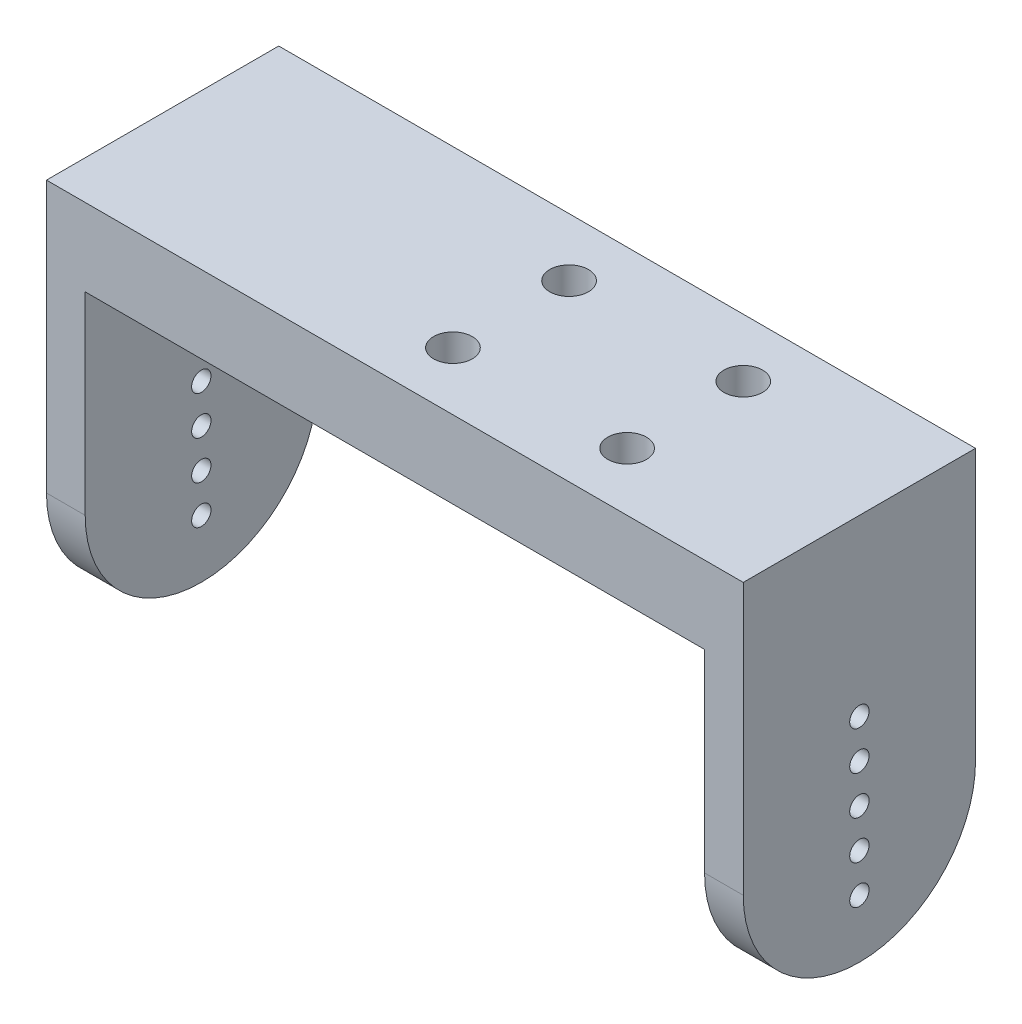
ISO-10303-21;
HEADER;
FILE_DESCRIPTION(('STEP AP214'),'2;1');
FILE_NAME('part.step','',(''),(''),'','','');
FILE_SCHEMA(('AUTOMOTIVE_DESIGN { 1 0 10303 214 1 1 1 1 }'));
ENDSEC;
DATA;
#1=APPLICATION_CONTEXT('core data for automotive mechanical design processes');
#2=APPLICATION_PROTOCOL_DEFINITION('international standard','automotive_design',2000,#1);
#3=PRODUCT_CONTEXT('',#1,'mechanical');
#4=PRODUCT('Part','Part','',(#3));
#5=PRODUCT_RELATED_PRODUCT_CATEGORY('part','',(#4));
#6=PRODUCT_DEFINITION_FORMATION('','',#4);
#7=PRODUCT_DEFINITION_CONTEXT('part definition',#1,'design');
#8=PRODUCT_DEFINITION('design','',#6,#7);
#9=PRODUCT_DEFINITION_SHAPE('','',#8);
#10=(LENGTH_UNIT() NAMED_UNIT(*) SI_UNIT(.MILLI.,.METRE.));
#11=(NAMED_UNIT(*) PLANE_ANGLE_UNIT() SI_UNIT($,.RADIAN.));
#12=(NAMED_UNIT(*) SI_UNIT($,.STERADIAN.) SOLID_ANGLE_UNIT());
#13=UNCERTAINTY_MEASURE_WITH_UNIT(LENGTH_MEASURE(1.E-05),#10,'distance_accuracy_value','');
#14=(GEOMETRIC_REPRESENTATION_CONTEXT(3) GLOBAL_UNCERTAINTY_ASSIGNED_CONTEXT((#13)) GLOBAL_UNIT_ASSIGNED_CONTEXT((#10,
#11,#12)) REPRESENTATION_CONTEXT('',''));
#15=CARTESIAN_POINT('',(0.,0.,0.));
#16=DIRECTION('',(0.,0.,1.));
#17=DIRECTION('',(1.,0.,0.));
#18=AXIS2_PLACEMENT_3D('',#15,#16,#17);
#19=CARTESIAN_POINT('',(0.,8.,0.));
#20=DIRECTION('',(0.,1.,0.));
#21=DIRECTION('',(-1.,0.,0.));
#22=AXIS2_PLACEMENT_3D('',#19,#20,#21);
#23=PLANE('',#22);
#24=CARTESIAN_POINT('',(8.99999999999999,8.,3.));
#25=DIRECTION('',(0.,1.,0.));
#26=DIRECTION('',(-1.,0.,0.));
#27=AXIS2_PLACEMENT_3D('',#24,#25,#26);
#28=CIRCLE('',#27,1.);
#29=CARTESIAN_POINT('',(7.99999999999999,8.,3.));
#30=VERTEX_POINT('',#29);
#31=EDGE_CURVE('E184',#30,#30,#28,.T.);
#32=ORIENTED_EDGE('',*,*,#31,.T.);
#33=EDGE_LOOP('',(#32));
#34=FACE_BOUND('',#33,.T.);
#35=CARTESIAN_POINT('',(8.99999999999999,8.,9.));
#36=DIRECTION('',(0.,1.,0.));
#37=DIRECTION('',(-1.,0.,0.));
#38=AXIS2_PLACEMENT_3D('',#35,#36,#37);
#39=CIRCLE('',#38,1.);
#40=CARTESIAN_POINT('',(7.99999999999999,8.,9.));
#41=VERTEX_POINT('',#40);
#42=EDGE_CURVE('E189',#41,#41,#39,.F.);
#43=ORIENTED_EDGE('',*,*,#42,.F.);
#44=EDGE_LOOP('',(#43));
#45=FACE_BOUND('',#44,.T.);
#46=CARTESIAN_POINT('',(0.,8.,9.));
#47=DIRECTION('',(0.,1.,0.));
#48=DIRECTION('',(-1.,0.,0.));
#49=AXIS2_PLACEMENT_3D('',#46,#47,#48);
#50=CIRCLE('',#49,1.);
#51=CARTESIAN_POINT('',(-1.00000000000001,8.,9.));
#52=VERTEX_POINT('',#51);
#53=EDGE_CURVE('E192',#52,#52,#50,.F.);
#54=ORIENTED_EDGE('',*,*,#53,.F.);
#55=EDGE_LOOP('',(#54));
#56=FACE_BOUND('',#55,.T.);
#57=CARTESIAN_POINT('',(0.,8.,3.));
#58=DIRECTION('',(0.,1.,0.));
#59=DIRECTION('',(-1.,0.,0.));
#60=AXIS2_PLACEMENT_3D('',#57,#58,#59);
#61=CIRCLE('',#60,1.);
#62=CARTESIAN_POINT('',(-1.00000000000001,8.,3.));
#63=VERTEX_POINT('',#62);
#64=EDGE_CURVE('E196',#63,#63,#61,.T.);
#65=ORIENTED_EDGE('',*,*,#64,.T.);
#66=EDGE_LOOP('',(#65));
#67=FACE_BOUND('',#66,.T.);
#68=DIRECTION('',(-1.,0.,0.));
#69=VECTOR('',#68,1.);
#70=CARTESIAN_POINT('',(-16.,8.,1.));
#71=LINE('',#70,#69);
#72=CARTESIAN_POINT('',(16.,8.,1.));
#73=VERTEX_POINT('',#72);
#74=CARTESIAN_POINT('',(-16.,8.,1.));
#75=VERTEX_POINT('',#74);
#76=EDGE_CURVE('E146',#73,#75,#71,.T.);
#77=ORIENTED_EDGE('',*,*,#76,.F.);
#78=DIRECTION('',(0.,0.,1.));
#79=VECTOR('',#78,1.);
#80=CARTESIAN_POINT('',(16.,8.,0.));
#81=LINE('',#80,#79);
#82=CARTESIAN_POINT('',(16.,8.,11.));
#83=VERTEX_POINT('',#82);
#84=EDGE_CURVE('E57',#73,#83,#81,.T.);
#85=ORIENTED_EDGE('',*,*,#84,.T.);
#86=DIRECTION('',(1.,0.,0.));
#87=VECTOR('',#86,1.);
#88=CARTESIAN_POINT('',(-16.,8.,11.));
#89=LINE('',#88,#87);
#90=CARTESIAN_POINT('',(-16.,8.,11.));
#91=VERTEX_POINT('',#90);
#92=EDGE_CURVE('E271',#91,#83,#89,.T.);
#93=ORIENTED_EDGE('',*,*,#92,.F.);
#94=DIRECTION('',(0.,0.,1.));
#95=VECTOR('',#94,1.);
#96=CARTESIAN_POINT('',(-16.,8.,0.));
#97=LINE('',#96,#95);
#98=EDGE_CURVE('E152',#75,#91,#97,.T.);
#99=ORIENTED_EDGE('',*,*,#98,.F.);
#100=EDGE_LOOP('',(#77,#85,#93,#99));
#101=FACE_BOUND('',#100,.T.);
#102=ADVANCED_FACE('F32',(#34,#45,#56,#67,#101),#23,.F.);
#103=CARTESIAN_POINT('',(16.,0.,0.));
#104=DIRECTION('',(1.,0.,0.));
#105=DIRECTION('',(0.,0.,-1.));
#106=AXIS2_PLACEMENT_3D('',#103,#104,#105);
#107=PLANE('',#106);
#108=CARTESIAN_POINT('',(16.,-4.99999999999999,6.));
#109=DIRECTION('',(1.,0.,0.));
#110=DIRECTION('',(0.,0.,-1.));
#111=AXIS2_PLACEMENT_3D('',#108,#109,#110);
#112=CIRCLE('',#111,0.5);
#113=CARTESIAN_POINT('',(16.,-4.99999999999999,5.5));
#114=VERTEX_POINT('',#113);
#115=EDGE_CURVE('E226',#114,#114,#112,.T.);
#116=ORIENTED_EDGE('',*,*,#115,.T.);
#117=EDGE_LOOP('',(#116));
#118=FACE_BOUND('',#117,.T.);
#119=CARTESIAN_POINT('',(16.,-2.99999999999999,6.));
#120=DIRECTION('',(1.,0.,0.));
#121=DIRECTION('',(0.,0.,-1.));
#122=AXIS2_PLACEMENT_3D('',#119,#120,#121);
#123=CIRCLE('',#122,0.5);
#124=CARTESIAN_POINT('',(16.,-2.99999999999999,5.5));
#125=VERTEX_POINT('',#124);
#126=EDGE_CURVE('E214',#125,#125,#123,.T.);
#127=ORIENTED_EDGE('',*,*,#126,.T.);
#128=EDGE_LOOP('',(#127));
#129=FACE_BOUND('',#128,.T.);
#130=CARTESIAN_POINT('',(16.,-0.999999999999992,6.));
#131=DIRECTION('',(1.,0.,0.));
#132=DIRECTION('',(0.,0.,-1.));
#133=AXIS2_PLACEMENT_3D('',#130,#131,#132);
#134=CIRCLE('',#133,0.5);
#135=CARTESIAN_POINT('',(16.,-0.999999999999992,5.5));
#136=VERTEX_POINT('',#135);
#137=EDGE_CURVE('E211',#136,#136,#134,.T.);
#138=ORIENTED_EDGE('',*,*,#137,.T.);
#139=EDGE_LOOP('',(#138));
#140=FACE_BOUND('',#139,.T.);
#141=CARTESIAN_POINT('',(16.,1.00000000000001,6.));
#142=DIRECTION('',(1.,0.,0.));
#143=DIRECTION('',(0.,0.,-1.));
#144=AXIS2_PLACEMENT_3D('',#141,#142,#143);
#145=CIRCLE('',#144,0.5);
#146=CARTESIAN_POINT('',(16.,1.00000000000001,5.5));
#147=VERTEX_POINT('',#146);
#148=EDGE_CURVE('E207',#147,#147,#145,.T.);
#149=ORIENTED_EDGE('',*,*,#148,.T.);
#150=EDGE_LOOP('',(#149));
#151=FACE_BOUND('',#150,.T.);
#152=CARTESIAN_POINT('',(16.,-6.99999999999999,6.));
#153=DIRECTION('',(1.,0.,0.));
#154=DIRECTION('',(0.,0.,-1.));
#155=AXIS2_PLACEMENT_3D('',#152,#153,#154);
#156=CIRCLE('',#155,0.5);
#157=CARTESIAN_POINT('',(16.,-6.99999999999999,5.5));
#158=VERTEX_POINT('',#157);
#159=EDGE_CURVE('E202',#158,#158,#156,.T.);
#160=ORIENTED_EDGE('',*,*,#159,.T.);
#161=EDGE_LOOP('',(#160));
#162=FACE_BOUND('',#161,.T.);
#163=DIRECTION('',(0.,1.,0.));
#164=VECTOR('',#163,1.);
#165=CARTESIAN_POINT('',(16.,6.,1.));
#166=LINE('',#165,#164);
#167=CARTESIAN_POINT('',(16.,6.,1.));
#168=VERTEX_POINT('',#167);
#169=EDGE_CURVE('E263',#168,#73,#166,.T.);
#170=ORIENTED_EDGE('',*,*,#169,.F.);
#171=DIRECTION('',(0.,0.,1.));
#172=VECTOR('',#171,1.);
#173=CARTESIAN_POINT('',(16.,6.,1.));
#174=LINE('',#173,#172);
#175=CARTESIAN_POINT('',(16.,6.,0.));
#176=VERTEX_POINT('',#175);
#177=EDGE_CURVE('E136',#176,#168,#174,.T.);
#178=ORIENTED_EDGE('',*,*,#177,.F.);
#179=DIRECTION('',(0.,1.,0.));
#180=VECTOR('',#179,1.);
#181=CARTESIAN_POINT('',(16.,0.,0.));
#182=LINE('',#181,#180);
#183=CARTESIAN_POINT('',(16.,-3.99999999999999,0.));
#184=VERTEX_POINT('',#183);
#185=EDGE_CURVE('E133',#184,#176,#182,.T.);
#186=ORIENTED_EDGE('',*,*,#185,.F.);
#187=CARTESIAN_POINT('',(16.,-3.99999999999999,6.));
#188=DIRECTION('',(1.,0.,0.));
#189=DIRECTION('',(0.,0.,-1.));
#190=AXIS2_PLACEMENT_3D('',#187,#188,#189);
#191=CIRCLE('',#190,6.);
#192=CARTESIAN_POINT('',(16.,-3.99999999999999,12.));
#193=VERTEX_POINT('',#192);
#194=EDGE_CURVE('E160',#193,#184,#191,.T.);
#195=ORIENTED_EDGE('',*,*,#194,.F.);
#196=DIRECTION('',(0.,1.,0.));
#197=VECTOR('',#196,1.);
#198=CARTESIAN_POINT('',(16.,0.,12.));
#199=LINE('',#198,#197);
#200=CARTESIAN_POINT('',(16.,6.,12.));
#201=VERTEX_POINT('',#200);
#202=EDGE_CURVE('E158',#193,#201,#199,.T.);
#203=ORIENTED_EDGE('',*,*,#202,.T.);
#204=DIRECTION('',(0.,0.,1.));
#205=VECTOR('',#204,1.);
#206=CARTESIAN_POINT('',(16.,6.,12.));
#207=LINE('',#206,#205);
#208=CARTESIAN_POINT('',(16.,6.,11.));
#209=VERTEX_POINT('',#208);
#210=EDGE_CURVE('E49',#209,#201,#207,.T.);
#211=ORIENTED_EDGE('',*,*,#210,.F.);
#212=DIRECTION('',(0.,1.,0.));
#213=VECTOR('',#212,1.);
#214=CARTESIAN_POINT('',(16.,6.,11.));
#215=LINE('',#214,#213);
#216=EDGE_CURVE('E281',#209,#83,#215,.T.);
#217=ORIENTED_EDGE('',*,*,#216,.T.);
#218=ORIENTED_EDGE('',*,*,#84,.F.);
#219=EDGE_LOOP('',(#170,#178,#186,#195,#203,#211,#217,#218));
#220=FACE_BOUND('',#219,.T.);
#221=ADVANCED_FACE('F262',(#118,#129,#140,#151,#162,#220),#107,.F.);
#222=CARTESIAN_POINT('',(-16.,0.,0.));
#223=DIRECTION('',(-1.,0.,0.));
#224=DIRECTION('',(0.,-1.,0.));
#225=AXIS2_PLACEMENT_3D('',#222,#223,#224);
#226=PLANE('',#225);
#227=CARTESIAN_POINT('',(-16.,-4.99999999999999,6.));
#228=DIRECTION('',(-1.,0.,0.));
#229=DIRECTION('',(0.,-1.,0.));
#230=AXIS2_PLACEMENT_3D('',#227,#228,#229);
#231=CIRCLE('',#230,0.5);
#232=CARTESIAN_POINT('',(-16.,-5.49999999999999,6.));
#233=VERTEX_POINT('',#232);
#234=EDGE_CURVE('E36',#233,#233,#231,.T.);
#235=ORIENTED_EDGE('',*,*,#234,.T.);
#236=EDGE_LOOP('',(#235));
#237=FACE_BOUND('',#236,.T.);
#238=CARTESIAN_POINT('',(-16.,-2.99999999999999,6.));
#239=DIRECTION('',(-1.,0.,0.));
#240=DIRECTION('',(0.,-1.,0.));
#241=AXIS2_PLACEMENT_3D('',#238,#239,#240);
#242=CIRCLE('',#241,0.5);
#243=CARTESIAN_POINT('',(-16.,-3.49999999999999,6.));
#244=VERTEX_POINT('',#243);
#245=EDGE_CURVE('E212',#244,#244,#242,.T.);
#246=ORIENTED_EDGE('',*,*,#245,.T.);
#247=EDGE_LOOP('',(#246));
#248=FACE_BOUND('',#247,.T.);
#249=CARTESIAN_POINT('',(-16.,-0.999999999999992,6.));
#250=DIRECTION('',(-1.,0.,0.));
#251=DIRECTION('',(0.,-1.,0.));
#252=AXIS2_PLACEMENT_3D('',#249,#250,#251);
#253=CIRCLE('',#252,0.5);
#254=CARTESIAN_POINT('',(-16.,-1.49999999999999,6.));
#255=VERTEX_POINT('',#254);
#256=EDGE_CURVE('E209',#255,#255,#253,.T.);
#257=ORIENTED_EDGE('',*,*,#256,.T.);
#258=EDGE_LOOP('',(#257));
#259=FACE_BOUND('',#258,.T.);
#260=CARTESIAN_POINT('',(-16.,1.00000000000001,6.));
#261=DIRECTION('',(-1.,0.,0.));
#262=DIRECTION('',(0.,-1.,0.));
#263=AXIS2_PLACEMENT_3D('',#260,#261,#262);
#264=CIRCLE('',#263,0.5);
#265=CARTESIAN_POINT('',(-16.,0.500000000000008,6.));
#266=VERTEX_POINT('',#265);
#267=EDGE_CURVE('E204',#266,#266,#264,.T.);
#268=ORIENTED_EDGE('',*,*,#267,.T.);
#269=EDGE_LOOP('',(#268));
#270=FACE_BOUND('',#269,.T.);
#271=CARTESIAN_POINT('',(-16.,-6.99999999999999,6.));
#272=DIRECTION('',(-1.,0.,0.));
#273=DIRECTION('',(0.,-1.,0.));
#274=AXIS2_PLACEMENT_3D('',#271,#272,#273);
#275=CIRCLE('',#274,0.5);
#276=CARTESIAN_POINT('',(-16.,-7.49999999999999,6.));
#277=VERTEX_POINT('',#276);
#278=EDGE_CURVE('E199',#277,#277,#275,.T.);
#279=ORIENTED_EDGE('',*,*,#278,.T.);
#280=EDGE_LOOP('',(#279));
#281=FACE_BOUND('',#280,.T.);
#282=DIRECTION('',(0.,1.,0.));
#283=VECTOR('',#282,1.);
#284=CARTESIAN_POINT('',(-16.,6.,1.));
#285=LINE('',#284,#283);
#286=CARTESIAN_POINT('',(-16.,6.,1.));
#287=VERTEX_POINT('',#286);
#288=EDGE_CURVE('E265',#287,#75,#285,.T.);
#289=ORIENTED_EDGE('',*,*,#288,.T.);
#290=ORIENTED_EDGE('',*,*,#98,.T.);
#291=DIRECTION('',(0.,1.,0.));
#292=VECTOR('',#291,1.);
#293=CARTESIAN_POINT('',(-16.,6.,11.));
#294=LINE('',#293,#292);
#295=CARTESIAN_POINT('',(-16.,6.,11.));
#296=VERTEX_POINT('',#295);
#297=EDGE_CURVE('E285',#296,#91,#294,.T.);
#298=ORIENTED_EDGE('',*,*,#297,.F.);
#299=DIRECTION('',(0.,0.,-1.));
#300=VECTOR('',#299,1.);
#301=CARTESIAN_POINT('',(-16.,6.,12.));
#302=LINE('',#301,#300);
#303=CARTESIAN_POINT('',(-16.,6.,12.));
#304=VERTEX_POINT('',#303);
#305=EDGE_CURVE('E272',#304,#296,#302,.T.);
#306=ORIENTED_EDGE('',*,*,#305,.F.);
#307=DIRECTION('',(0.,-1.,0.));
#308=VECTOR('',#307,1.);
#309=CARTESIAN_POINT('',(-16.,0.,12.));
#310=LINE('',#309,#308);
#311=CARTESIAN_POINT('',(-16.,-3.99999999999999,12.));
#312=VERTEX_POINT('',#311);
#313=EDGE_CURVE('E154',#304,#312,#310,.T.);
#314=ORIENTED_EDGE('',*,*,#313,.T.);
#315=CARTESIAN_POINT('',(-16.,-3.99999999999999,6.));
#316=DIRECTION('',(-1.,0.,0.));
#317=DIRECTION('',(0.,-1.,0.));
#318=AXIS2_PLACEMENT_3D('',#315,#316,#317);
#319=CIRCLE('',#318,6.);
#320=CARTESIAN_POINT('',(-16.,-3.99999999999999,0.));
#321=VERTEX_POINT('',#320);
#322=EDGE_CURVE('E41',#321,#312,#319,.T.);
#323=ORIENTED_EDGE('',*,*,#322,.F.);
#324=DIRECTION('',(0.,-1.,0.));
#325=VECTOR('',#324,1.);
#326=CARTESIAN_POINT('',(-16.,0.,0.));
#327=LINE('',#326,#325);
#328=CARTESIAN_POINT('',(-16.,6.,0.));
#329=VERTEX_POINT('',#328);
#330=EDGE_CURVE('E129',#329,#321,#327,.T.);
#331=ORIENTED_EDGE('',*,*,#330,.F.);
#332=DIRECTION('',(0.,0.,-1.));
#333=VECTOR('',#332,1.);
#334=CARTESIAN_POINT('',(-16.,6.,1.));
#335=LINE('',#334,#333);
#336=EDGE_CURVE('E137',#287,#329,#335,.T.);
#337=ORIENTED_EDGE('',*,*,#336,.F.);
#338=EDGE_LOOP('',(#289,#290,#298,#306,#314,#323,#331,#337));
#339=FACE_BOUND('',#338,.T.);
#340=ADVANCED_FACE('F148',(#237,#248,#259,#270,#281,#339),#226,.F.);
#341=CARTESIAN_POINT('',(-18.,10.,12.));
#342=DIRECTION('',(0.,-1.,0.));
#343=DIRECTION('',(0.,0.,-1.));
#344=AXIS2_PLACEMENT_3D('',#341,#342,#343);
#345=PLANE('',#344);
#346=DIRECTION('',(-1.,0.,0.));
#347=VECTOR('',#346,1.);
#348=CARTESIAN_POINT('',(-18.,10.,0.));
#349=LINE('',#348,#347);
#350=CARTESIAN_POINT('',(18.,10.,0.));
#351=VERTEX_POINT('',#350);
#352=CARTESIAN_POINT('',(-18.,10.,0.));
#353=VERTEX_POINT('',#352);
#354=EDGE_CURVE('E174',#351,#353,#349,.T.);
#355=ORIENTED_EDGE('',*,*,#354,.T.);
#356=DIRECTION('',(0.,0.,-1.));
#357=VECTOR('',#356,1.);
#358=CARTESIAN_POINT('',(-18.,10.,12.));
#359=LINE('',#358,#357);
#360=CARTESIAN_POINT('',(-18.,10.,12.));
#361=VERTEX_POINT('',#360);
#362=EDGE_CURVE('E172',#361,#353,#359,.T.);
#363=ORIENTED_EDGE('',*,*,#362,.F.);
#364=DIRECTION('',(-1.,0.,0.));
#365=VECTOR('',#364,1.);
#366=CARTESIAN_POINT('',(-18.,10.,12.));
#367=LINE('',#366,#365);
#368=CARTESIAN_POINT('',(18.,10.,12.));
#369=VERTEX_POINT('',#368);
#370=EDGE_CURVE('E166',#369,#361,#367,.T.);
#371=ORIENTED_EDGE('',*,*,#370,.F.);
#372=DIRECTION('',(0.,0.,-1.));
#373=VECTOR('',#372,1.);
#374=CARTESIAN_POINT('',(18.,10.,12.));
#375=LINE('',#374,#373);
#376=EDGE_CURVE('E180',#369,#351,#375,.T.);
#377=ORIENTED_EDGE('',*,*,#376,.T.);
#378=EDGE_LOOP('',(#355,#363,#371,#377));
#379=FACE_BOUND('',#378,.T.);
#380=CARTESIAN_POINT('',(8.99999999999999,10.,3.));
#381=DIRECTION('',(0.,1.,0.));
#382=DIRECTION('',(0.,0.,1.));
#383=AXIS2_PLACEMENT_3D('',#380,#381,#382);
#384=CIRCLE('',#383,1.);
#385=CARTESIAN_POINT('',(8.99999999999999,10.,4.));
#386=VERTEX_POINT('',#385);
#387=EDGE_CURVE('E188',#386,#386,#384,.T.);
#388=ORIENTED_EDGE('',*,*,#387,.F.);
#389=EDGE_LOOP('',(#388));
#390=FACE_BOUND('',#389,.T.);
#391=CARTESIAN_POINT('',(8.99999999999999,10.,9.));
#392=DIRECTION('',(0.,-1.,0.));
#393=DIRECTION('',(0.,0.,-1.));
#394=AXIS2_PLACEMENT_3D('',#391,#392,#393);
#395=CIRCLE('',#394,1.);
#396=CARTESIAN_POINT('',(8.99999999999999,10.,8.));
#397=VERTEX_POINT('',#396);
#398=EDGE_CURVE('E236',#397,#397,#395,.T.);
#399=ORIENTED_EDGE('',*,*,#398,.T.);
#400=EDGE_LOOP('',(#399));
#401=FACE_BOUND('',#400,.T.);
#402=CARTESIAN_POINT('',(0.,10.,9.));
#403=DIRECTION('',(0.,-1.,0.));
#404=DIRECTION('',(0.,0.,-1.));
#405=AXIS2_PLACEMENT_3D('',#402,#403,#404);
#406=CIRCLE('',#405,1.);
#407=CARTESIAN_POINT('',(0.,10.,8.));
#408=VERTEX_POINT('',#407);
#409=EDGE_CURVE('E239',#408,#408,#406,.T.);
#410=ORIENTED_EDGE('',*,*,#409,.T.);
#411=EDGE_LOOP('',(#410));
#412=FACE_BOUND('',#411,.T.);
#413=CARTESIAN_POINT('',(0.,10.,3.));
#414=DIRECTION('',(0.,1.,0.));
#415=DIRECTION('',(0.,0.,1.));
#416=AXIS2_PLACEMENT_3D('',#413,#414,#415);
#417=CIRCLE('',#416,1.);
#418=CARTESIAN_POINT('',(0.,10.,4.));
#419=VERTEX_POINT('',#418);
#420=EDGE_CURVE('E193',#419,#419,#417,.T.);
#421=ORIENTED_EDGE('',*,*,#420,.F.);
#422=EDGE_LOOP('',(#421));
#423=FACE_BOUND('',#422,.T.);
#424=ADVANCED_FACE('F317',(#379,#390,#401,#412,#423),#345,.F.);
#425=CARTESIAN_POINT('',(18.,10.,12.));
#426=DIRECTION('',(-1.,0.,0.));
#427=DIRECTION('',(0.,-1.,0.));
#428=AXIS2_PLACEMENT_3D('',#425,#426,#427);
#429=PLANE('',#428);
#430=CARTESIAN_POINT('',(18.,-4.99999999999999,6.));
#431=DIRECTION('',(1.,0.,0.));
#432=DIRECTION('',(0.,0.,-1.));
#433=AXIS2_PLACEMENT_3D('',#430,#431,#432);
#434=CIRCLE('',#433,0.5);
#435=CARTESIAN_POINT('',(18.,-4.99999999999999,5.5));
#436=VERTEX_POINT('',#435);
#437=EDGE_CURVE('E291',#436,#436,#434,.T.);
#438=ORIENTED_EDGE('',*,*,#437,.F.);
#439=EDGE_LOOP('',(#438));
#440=FACE_BOUND('',#439,.T.);
#441=CARTESIAN_POINT('',(18.,-2.99999999999999,6.));
#442=DIRECTION('',(1.,0.,0.));
#443=DIRECTION('',(0.,0.,-1.));
#444=AXIS2_PLACEMENT_3D('',#441,#442,#443);
#445=CIRCLE('',#444,0.5);
#446=CARTESIAN_POINT('',(18.,-2.99999999999999,5.5));
#447=VERTEX_POINT('',#446);
#448=EDGE_CURVE('E297',#447,#447,#445,.T.);
#449=ORIENTED_EDGE('',*,*,#448,.F.);
#450=EDGE_LOOP('',(#449));
#451=FACE_BOUND('',#450,.T.);
#452=CARTESIAN_POINT('',(18.,-0.999999999999992,6.));
#453=DIRECTION('',(1.,0.,0.));
#454=DIRECTION('',(0.,0.,-1.));
#455=AXIS2_PLACEMENT_3D('',#452,#453,#454);
#456=CIRCLE('',#455,0.5);
#457=CARTESIAN_POINT('',(18.,-0.999999999999992,5.5));
#458=VERTEX_POINT('',#457);
#459=EDGE_CURVE('E303',#458,#458,#456,.T.);
#460=ORIENTED_EDGE('',*,*,#459,.F.);
#461=EDGE_LOOP('',(#460));
#462=FACE_BOUND('',#461,.T.);
#463=CARTESIAN_POINT('',(18.,1.00000000000001,6.));
#464=DIRECTION('',(1.,0.,0.));
#465=DIRECTION('',(0.,0.,-1.));
#466=AXIS2_PLACEMENT_3D('',#463,#464,#465);
#467=CIRCLE('',#466,0.5);
#468=CARTESIAN_POINT('',(18.,1.00000000000001,5.5));
#469=VERTEX_POINT('',#468);
#470=EDGE_CURVE('E288',#469,#469,#467,.T.);
#471=ORIENTED_EDGE('',*,*,#470,.F.);
#472=EDGE_LOOP('',(#471));
#473=FACE_BOUND('',#472,.T.);
#474=CARTESIAN_POINT('',(18.,-6.99999999999999,6.));
#475=DIRECTION('',(1.,0.,0.));
#476=DIRECTION('',(0.,0.,-1.));
#477=AXIS2_PLACEMENT_3D('',#474,#475,#476);
#478=CIRCLE('',#477,0.5);
#479=CARTESIAN_POINT('',(18.,-6.99999999999999,5.5));
#480=VERTEX_POINT('',#479);
#481=EDGE_CURVE('E229',#480,#480,#478,.T.);
#482=ORIENTED_EDGE('',*,*,#481,.F.);
#483=EDGE_LOOP('',(#482));
#484=FACE_BOUND('',#483,.T.);
#485=CARTESIAN_POINT('',(18.,-3.99999999999999,6.));
#486=DIRECTION('',(1.,0.,0.));
#487=DIRECTION('',(0.,0.,-1.));
#488=AXIS2_PLACEMENT_3D('',#485,#486,#487);
#489=CIRCLE('',#488,6.);
#490=CARTESIAN_POINT('',(18.,-3.99999999999999,12.));
#491=VERTEX_POINT('',#490);
#492=CARTESIAN_POINT('',(18.,-3.99999999999999,0.));
#493=VERTEX_POINT('',#492);
#494=EDGE_CURVE('E247',#491,#493,#489,.T.);
#495=ORIENTED_EDGE('',*,*,#494,.T.);
#496=DIRECTION('',(0.,1.,0.));
#497=VECTOR('',#496,1.);
#498=CARTESIAN_POINT('',(18.,10.,0.));
#499=LINE('',#498,#497);
#500=EDGE_CURVE('E162',#493,#351,#499,.T.);
#501=ORIENTED_EDGE('',*,*,#500,.T.);
#502=ORIENTED_EDGE('',*,*,#376,.F.);
#503=DIRECTION('',(0.,1.,0.));
#504=VECTOR('',#503,1.);
#505=CARTESIAN_POINT('',(18.,10.,12.));
#506=LINE('',#505,#504);
#507=EDGE_CURVE('E164',#491,#369,#506,.T.);
#508=ORIENTED_EDGE('',*,*,#507,.F.);
#509=EDGE_LOOP('',(#495,#501,#502,#508));
#510=FACE_BOUND('',#509,.T.);
#511=ADVANCED_FACE('F34',(#440,#451,#462,#473,#484,#510),#429,.F.);
#512=CARTESIAN_POINT('',(-18.,10.,12.));
#513=DIRECTION('',(1.,0.,0.));
#514=DIRECTION('',(0.,1.,0.));
#515=AXIS2_PLACEMENT_3D('',#512,#513,#514);
#516=PLANE('',#515);
#517=CARTESIAN_POINT('',(-18.,-4.99999999999999,6.));
#518=DIRECTION('',(1.,0.,0.));
#519=DIRECTION('',(0.,0.,-1.));
#520=AXIS2_PLACEMENT_3D('',#517,#518,#519);
#521=CIRCLE('',#520,0.5);
#522=CARTESIAN_POINT('',(-18.,-4.99999999999999,5.5));
#523=VERTEX_POINT('',#522);
#524=EDGE_CURVE('E208',#523,#523,#521,.T.);
#525=ORIENTED_EDGE('',*,*,#524,.T.);
#526=EDGE_LOOP('',(#525));
#527=FACE_BOUND('',#526,.T.);
#528=CARTESIAN_POINT('',(-18.,-2.99999999999999,6.));
#529=DIRECTION('',(1.,0.,0.));
#530=DIRECTION('',(0.,0.,-1.));
#531=AXIS2_PLACEMENT_3D('',#528,#529,#530);
#532=CIRCLE('',#531,0.5);
#533=CARTESIAN_POINT('',(-18.,-2.99999999999999,5.5));
#534=VERTEX_POINT('',#533);
#535=EDGE_CURVE('E294',#534,#534,#532,.T.);
#536=ORIENTED_EDGE('',*,*,#535,.T.);
#537=EDGE_LOOP('',(#536));
#538=FACE_BOUND('',#537,.T.);
#539=CARTESIAN_POINT('',(-18.,-0.999999999999992,6.));
#540=DIRECTION('',(1.,0.,0.));
#541=DIRECTION('',(0.,0.,-1.));
#542=AXIS2_PLACEMENT_3D('',#539,#540,#541);
#543=CIRCLE('',#542,0.5);
#544=CARTESIAN_POINT('',(-18.,-0.999999999999992,5.5));
#545=VERTEX_POINT('',#544);
#546=EDGE_CURVE('E300',#545,#545,#543,.T.);
#547=ORIENTED_EDGE('',*,*,#546,.T.);
#548=EDGE_LOOP('',(#547));
#549=FACE_BOUND('',#548,.T.);
#550=CARTESIAN_POINT('',(-18.,1.00000000000001,6.));
#551=DIRECTION('',(1.,0.,0.));
#552=DIRECTION('',(0.,0.,-1.));
#553=AXIS2_PLACEMENT_3D('',#550,#551,#552);
#554=CIRCLE('',#553,0.5);
#555=CARTESIAN_POINT('',(-18.,1.00000000000001,5.5));
#556=VERTEX_POINT('',#555);
#557=EDGE_CURVE('E306',#556,#556,#554,.T.);
#558=ORIENTED_EDGE('',*,*,#557,.T.);
#559=EDGE_LOOP('',(#558));
#560=FACE_BOUND('',#559,.T.);
#561=CARTESIAN_POINT('',(-18.,-6.99999999999999,6.));
#562=DIRECTION('',(1.,0.,0.));
#563=DIRECTION('',(0.,0.,-1.));
#564=AXIS2_PLACEMENT_3D('',#561,#562,#563);
#565=CIRCLE('',#564,0.5);
#566=CARTESIAN_POINT('',(-18.,-6.99999999999999,5.5));
#567=VERTEX_POINT('',#566);
#568=EDGE_CURVE('E203',#567,#567,#565,.T.);
#569=ORIENTED_EDGE('',*,*,#568,.T.);
#570=EDGE_LOOP('',(#569));
#571=FACE_BOUND('',#570,.T.);
#572=DIRECTION('',(0.,-1.,0.));
#573=VECTOR('',#572,1.);
#574=CARTESIAN_POINT('',(-18.,10.,0.));
#575=LINE('',#574,#573);
#576=CARTESIAN_POINT('',(-18.,-3.99999999999999,0.));
#577=VERTEX_POINT('',#576);
#578=EDGE_CURVE('E167',#353,#577,#575,.T.);
#579=ORIENTED_EDGE('',*,*,#578,.T.);
#580=CARTESIAN_POINT('',(-18.,-3.99999999999999,6.));
#581=DIRECTION('',(1.,0.,0.));
#582=DIRECTION('',(0.,0.,-1.));
#583=AXIS2_PLACEMENT_3D('',#580,#581,#582);
#584=CIRCLE('',#583,6.);
#585=CARTESIAN_POINT('',(-18.,-3.99999999999999,12.));
#586=VERTEX_POINT('',#585);
#587=EDGE_CURVE('E248',#586,#577,#584,.T.);
#588=ORIENTED_EDGE('',*,*,#587,.F.);
#589=DIRECTION('',(0.,-1.,0.));
#590=VECTOR('',#589,1.);
#591=CARTESIAN_POINT('',(-18.,10.,12.));
#592=LINE('',#591,#590);
#593=EDGE_CURVE('E169',#361,#586,#592,.T.);
#594=ORIENTED_EDGE('',*,*,#593,.F.);
#595=ORIENTED_EDGE('',*,*,#362,.T.);
#596=EDGE_LOOP('',(#579,#588,#594,#595));
#597=FACE_BOUND('',#596,.T.);
#598=ADVANCED_FACE('F316',(#527,#538,#549,#560,#571,#597),#516,.F.);
#599=CARTESIAN_POINT('',(0.,0.,0.));
#600=DIRECTION('',(0.,0.,1.));
#601=DIRECTION('',(1.,0.,0.));
#602=AXIS2_PLACEMENT_3D('',#599,#600,#601);
#603=PLANE('',#602);
#604=DIRECTION('',(1.,0.,0.));
#605=VECTOR('',#604,1.);
#606=CARTESIAN_POINT('',(-16.,6.,0.));
#607=LINE('',#606,#605);
#608=EDGE_CURVE('E124',#329,#176,#607,.T.);
#609=ORIENTED_EDGE('',*,*,#608,.F.);
#610=ORIENTED_EDGE('',*,*,#330,.T.);
#611=DIRECTION('',(1.,0.,0.));
#612=VECTOR('',#611,1.);
#613=CARTESIAN_POINT('',(-18.,-3.99999999999999,0.));
#614=LINE('',#613,#612);
#615=EDGE_CURVE('E187',#577,#321,#614,.T.);
#616=ORIENTED_EDGE('',*,*,#615,.F.);
#617=ORIENTED_EDGE('',*,*,#578,.F.);
#618=ORIENTED_EDGE('',*,*,#354,.F.);
#619=ORIENTED_EDGE('',*,*,#500,.F.);
#620=DIRECTION('',(1.,0.,0.));
#621=VECTOR('',#620,1.);
#622=CARTESIAN_POINT('',(-18.,-3.99999999999999,0.));
#623=LINE('',#622,#621);
#624=EDGE_CURVE('E11',#184,#493,#623,.T.);
#625=ORIENTED_EDGE('',*,*,#624,.F.);
#626=ORIENTED_EDGE('',*,*,#185,.T.);
#627=EDGE_LOOP('',(#609,#610,#616,#617,#618,#619,#625,#626));
#628=FACE_BOUND('',#627,.T.);
#629=ADVANCED_FACE('F126',(#628),#603,.F.);
#630=CARTESIAN_POINT('',(0.,0.,12.));
#631=DIRECTION('',(0.,0.,1.));
#632=DIRECTION('',(1.,0.,0.));
#633=AXIS2_PLACEMENT_3D('',#630,#631,#632);
#634=PLANE('',#633);
#635=ORIENTED_EDGE('',*,*,#313,.F.);
#636=DIRECTION('',(-1.,0.,0.));
#637=VECTOR('',#636,1.);
#638=CARTESIAN_POINT('',(-16.,6.,12.));
#639=LINE('',#638,#637);
#640=EDGE_CURVE('E278',#201,#304,#639,.T.);
#641=ORIENTED_EDGE('',*,*,#640,.F.);
#642=ORIENTED_EDGE('',*,*,#202,.F.);
#643=DIRECTION('',(1.,0.,0.));
#644=VECTOR('',#643,1.);
#645=CARTESIAN_POINT('',(-18.,-3.99999999999999,12.));
#646=LINE('',#645,#644);
#647=EDGE_CURVE('E250',#193,#491,#646,.T.);
#648=ORIENTED_EDGE('',*,*,#647,.T.);
#649=ORIENTED_EDGE('',*,*,#507,.T.);
#650=ORIENTED_EDGE('',*,*,#370,.T.);
#651=ORIENTED_EDGE('',*,*,#593,.T.);
#652=EDGE_CURVE('E252',#586,#312,#646,.T.);
#653=ORIENTED_EDGE('',*,*,#652,.T.);
#654=EDGE_LOOP('',(#635,#641,#642,#648,#649,#650,#651,#653));
#655=FACE_BOUND('',#654,.T.);
#656=ADVANCED_FACE('F325',(#655),#634,.T.);
#657=CARTESIAN_POINT('',(-18.,-3.99999999999999,6.));
#658=DIRECTION('',(1.,0.,0.));
#659=DIRECTION('',(0.,0.,-1.));
#660=AXIS2_PLACEMENT_3D('',#657,#658,#659);
#661=CYLINDRICAL_SURFACE('',#660,6.);
#662=ORIENTED_EDGE('',*,*,#322,.T.);
#663=ORIENTED_EDGE('',*,*,#652,.F.);
#664=ORIENTED_EDGE('',*,*,#587,.T.);
#665=ORIENTED_EDGE('',*,*,#615,.T.);
#666=EDGE_LOOP('',(#662,#663,#664,#665));
#667=FACE_BOUND('',#666,.T.);
#668=ADVANCED_FACE('F359',(#667),#661,.T.);
#669=ORIENTED_EDGE('',*,*,#194,.T.);
#670=ORIENTED_EDGE('',*,*,#624,.T.);
#671=ORIENTED_EDGE('',*,*,#494,.F.);
#672=ORIENTED_EDGE('',*,*,#647,.F.);
#673=EDGE_LOOP('',(#669,#670,#671,#672));
#674=FACE_BOUND('',#673,.T.);
#675=ADVANCED_FACE('F256',(#674),#661,.T.);
#676=CARTESIAN_POINT('',(8.99999999999999,0.,3.));
#677=DIRECTION('',(0.,1.,0.));
#678=DIRECTION('',(0.,0.,1.));
#679=AXIS2_PLACEMENT_3D('',#676,#677,#678);
#680=CYLINDRICAL_SURFACE('',#679,1.);
#681=ORIENTED_EDGE('',*,*,#387,.T.);
#682=EDGE_LOOP('',(#681));
#683=FACE_BOUND('',#682,.T.);
#684=ORIENTED_EDGE('',*,*,#31,.F.);
#685=EDGE_LOOP('',(#684));
#686=FACE_BOUND('',#685,.T.);
#687=ADVANCED_FACE('F402',(#683,#686),#680,.F.);
#688=CARTESIAN_POINT('',(8.99999999999999,0.,9.));
#689=DIRECTION('',(0.,1.,0.));
#690=DIRECTION('',(0.,0.,1.));
#691=AXIS2_PLACEMENT_3D('',#688,#689,#690);
#692=CYLINDRICAL_SURFACE('',#691,1.);
#693=ORIENTED_EDGE('',*,*,#398,.F.);
#694=EDGE_LOOP('',(#693));
#695=FACE_BOUND('',#694,.T.);
#696=ORIENTED_EDGE('',*,*,#42,.T.);
#697=EDGE_LOOP('',(#696));
#698=FACE_BOUND('',#697,.T.);
#699=ADVANCED_FACE('F395',(#695,#698),#692,.F.);
#700=CARTESIAN_POINT('',(0.,0.,9.));
#701=DIRECTION('',(0.,1.,0.));
#702=DIRECTION('',(0.,0.,1.));
#703=AXIS2_PLACEMENT_3D('',#700,#701,#702);
#704=CYLINDRICAL_SURFACE('',#703,1.);
#705=ORIENTED_EDGE('',*,*,#409,.F.);
#706=EDGE_LOOP('',(#705));
#707=FACE_BOUND('',#706,.T.);
#708=ORIENTED_EDGE('',*,*,#53,.T.);
#709=EDGE_LOOP('',(#708));
#710=FACE_BOUND('',#709,.T.);
#711=ADVANCED_FACE('F384',(#707,#710),#704,.F.);
#712=CARTESIAN_POINT('',(0.,0.,3.));
#713=DIRECTION('',(0.,1.,0.));
#714=DIRECTION('',(0.,0.,1.));
#715=AXIS2_PLACEMENT_3D('',#712,#713,#714);
#716=CYLINDRICAL_SURFACE('',#715,1.);
#717=ORIENTED_EDGE('',*,*,#420,.T.);
#718=EDGE_LOOP('',(#717));
#719=FACE_BOUND('',#718,.T.);
#720=ORIENTED_EDGE('',*,*,#64,.F.);
#721=EDGE_LOOP('',(#720));
#722=FACE_BOUND('',#721,.T.);
#723=ADVANCED_FACE('F380',(#719,#722),#716,.F.);
#724=CARTESIAN_POINT('',(-18.,-6.99999999999999,6.));
#725=DIRECTION('',(1.,0.,0.));
#726=DIRECTION('',(0.,0.,-1.));
#727=AXIS2_PLACEMENT_3D('',#724,#725,#726);
#728=CYLINDRICAL_SURFACE('',#727,0.5);
#729=ORIENTED_EDGE('',*,*,#568,.F.);
#730=EDGE_LOOP('',(#729));
#731=FACE_BOUND('',#730,.T.);
#732=ORIENTED_EDGE('',*,*,#278,.F.);
#733=EDGE_LOOP('',(#732));
#734=FACE_BOUND('',#733,.T.);
#735=ADVANCED_FACE('F383',(#731,#734),#728,.F.);
#736=ORIENTED_EDGE('',*,*,#481,.T.);
#737=EDGE_LOOP('',(#736));
#738=FACE_BOUND('',#737,.T.);
#739=ORIENTED_EDGE('',*,*,#159,.F.);
#740=EDGE_LOOP('',(#739));
#741=FACE_BOUND('',#740,.T.);
#742=ADVANCED_FACE('F392',(#738,#741),#728,.F.);
#743=CARTESIAN_POINT('',(-18.,1.00000000000001,6.));
#744=DIRECTION('',(1.,0.,0.));
#745=DIRECTION('',(0.,0.,-1.));
#746=AXIS2_PLACEMENT_3D('',#743,#744,#745);
#747=CYLINDRICAL_SURFACE('',#746,0.5);
#748=ORIENTED_EDGE('',*,*,#557,.F.);
#749=EDGE_LOOP('',(#748));
#750=FACE_BOUND('',#749,.T.);
#751=ORIENTED_EDGE('',*,*,#267,.F.);
#752=EDGE_LOOP('',(#751));
#753=FACE_BOUND('',#752,.T.);
#754=ADVANCED_FACE('F488',(#750,#753),#747,.F.);
#755=CARTESIAN_POINT('',(-18.,-0.999999999999992,6.));
#756=DIRECTION('',(1.,0.,0.));
#757=DIRECTION('',(0.,0.,-1.));
#758=AXIS2_PLACEMENT_3D('',#755,#756,#757);
#759=CYLINDRICAL_SURFACE('',#758,0.5);
#760=ORIENTED_EDGE('',*,*,#546,.F.);
#761=EDGE_LOOP('',(#760));
#762=FACE_BOUND('',#761,.T.);
#763=ORIENTED_EDGE('',*,*,#256,.F.);
#764=EDGE_LOOP('',(#763));
#765=FACE_BOUND('',#764,.T.);
#766=ADVANCED_FACE('F496',(#762,#765),#759,.F.);
#767=CARTESIAN_POINT('',(-18.,-2.99999999999999,6.));
#768=DIRECTION('',(1.,0.,0.));
#769=DIRECTION('',(0.,0.,-1.));
#770=AXIS2_PLACEMENT_3D('',#767,#768,#769);
#771=CYLINDRICAL_SURFACE('',#770,0.5);
#772=ORIENTED_EDGE('',*,*,#535,.F.);
#773=EDGE_LOOP('',(#772));
#774=FACE_BOUND('',#773,.T.);
#775=ORIENTED_EDGE('',*,*,#245,.F.);
#776=EDGE_LOOP('',(#775));
#777=FACE_BOUND('',#776,.T.);
#778=ADVANCED_FACE('F504',(#774,#777),#771,.F.);
#779=CARTESIAN_POINT('',(-18.,-4.99999999999999,6.));
#780=DIRECTION('',(1.,0.,0.));
#781=DIRECTION('',(0.,0.,-1.));
#782=AXIS2_PLACEMENT_3D('',#779,#780,#781);
#783=CYLINDRICAL_SURFACE('',#782,0.5);
#784=ORIENTED_EDGE('',*,*,#524,.F.);
#785=EDGE_LOOP('',(#784));
#786=FACE_BOUND('',#785,.T.);
#787=ORIENTED_EDGE('',*,*,#234,.F.);
#788=EDGE_LOOP('',(#787));
#789=FACE_BOUND('',#788,.T.);
#790=ADVANCED_FACE('F514',(#786,#789),#783,.F.);
#791=ORIENTED_EDGE('',*,*,#470,.T.);
#792=EDGE_LOOP('',(#791));
#793=FACE_BOUND('',#792,.T.);
#794=ORIENTED_EDGE('',*,*,#148,.F.);
#795=EDGE_LOOP('',(#794));
#796=FACE_BOUND('',#795,.T.);
#797=ADVANCED_FACE('F311',(#793,#796),#747,.F.);
#798=ORIENTED_EDGE('',*,*,#459,.T.);
#799=EDGE_LOOP('',(#798));
#800=FACE_BOUND('',#799,.T.);
#801=ORIENTED_EDGE('',*,*,#137,.F.);
#802=EDGE_LOOP('',(#801));
#803=FACE_BOUND('',#802,.T.);
#804=ADVANCED_FACE('F507',(#800,#803),#759,.F.);
#805=ORIENTED_EDGE('',*,*,#448,.T.);
#806=EDGE_LOOP('',(#805));
#807=FACE_BOUND('',#806,.T.);
#808=ORIENTED_EDGE('',*,*,#126,.F.);
#809=EDGE_LOOP('',(#808));
#810=FACE_BOUND('',#809,.T.);
#811=ADVANCED_FACE('F517',(#807,#810),#771,.F.);
#812=ORIENTED_EDGE('',*,*,#437,.T.);
#813=EDGE_LOOP('',(#812));
#814=FACE_BOUND('',#813,.T.);
#815=ORIENTED_EDGE('',*,*,#115,.F.);
#816=EDGE_LOOP('',(#815));
#817=FACE_BOUND('',#816,.T.);
#818=ADVANCED_FACE('F526',(#814,#817),#783,.F.);
#819=CARTESIAN_POINT('',(-16.,6.,11.));
#820=DIRECTION('',(0.,0.,1.));
#821=DIRECTION('',(1.,0.,0.));
#822=AXIS2_PLACEMENT_3D('',#819,#820,#821);
#823=PLANE('',#822);
#824=ORIENTED_EDGE('',*,*,#92,.T.);
#825=ORIENTED_EDGE('',*,*,#216,.F.);
#826=DIRECTION('',(1.,0.,0.));
#827=VECTOR('',#826,1.);
#828=CARTESIAN_POINT('',(-16.,6.,11.));
#829=LINE('',#828,#827);
#830=EDGE_CURVE('E275',#296,#209,#829,.T.);
#831=ORIENTED_EDGE('',*,*,#830,.F.);
#832=ORIENTED_EDGE('',*,*,#297,.T.);
#833=EDGE_LOOP('',(#824,#825,#831,#832));
#834=FACE_BOUND('',#833,.T.);
#835=ADVANCED_FACE('F333',(#834),#823,.F.);
#836=CARTESIAN_POINT('',(0.,6.,0.));
#837=DIRECTION('',(0.,-1.,0.));
#838=DIRECTION('',(1.,0.,0.));
#839=AXIS2_PLACEMENT_3D('',#836,#837,#838);
#840=PLANE('',#839);
#841=ORIENTED_EDGE('',*,*,#305,.T.);
#842=ORIENTED_EDGE('',*,*,#830,.T.);
#843=ORIENTED_EDGE('',*,*,#210,.T.);
#844=ORIENTED_EDGE('',*,*,#640,.T.);
#845=EDGE_LOOP('',(#841,#842,#843,#844));
#846=FACE_BOUND('',#845,.T.);
#847=ADVANCED_FACE('F329',(#846),#840,.T.);
#848=CARTESIAN_POINT('',(-16.,6.,1.));
#849=DIRECTION('',(0.,0.,-1.));
#850=DIRECTION('',(-1.,0.,0.));
#851=AXIS2_PLACEMENT_3D('',#848,#849,#850);
#852=PLANE('',#851);
#853=ORIENTED_EDGE('',*,*,#76,.T.);
#854=ORIENTED_EDGE('',*,*,#288,.F.);
#855=DIRECTION('',(-1.,0.,0.));
#856=VECTOR('',#855,1.);
#857=CARTESIAN_POINT('',(-16.,6.,1.));
#858=LINE('',#857,#856);
#859=EDGE_CURVE('E142',#168,#287,#858,.T.);
#860=ORIENTED_EDGE('',*,*,#859,.F.);
#861=ORIENTED_EDGE('',*,*,#169,.T.);
#862=EDGE_LOOP('',(#853,#854,#860,#861));
#863=FACE_BOUND('',#862,.T.);
#864=ADVANCED_FACE('F336',(#863),#852,.F.);
#865=CARTESIAN_POINT('',(0.,6.,0.));
#866=DIRECTION('',(0.,-1.,0.));
#867=DIRECTION('',(1.,0.,0.));
#868=AXIS2_PLACEMENT_3D('',#865,#866,#867);
#869=PLANE('',#868);
#870=ORIENTED_EDGE('',*,*,#336,.T.);
#871=ORIENTED_EDGE('',*,*,#608,.T.);
#872=ORIENTED_EDGE('',*,*,#177,.T.);
#873=ORIENTED_EDGE('',*,*,#859,.T.);
#874=EDGE_LOOP('',(#870,#871,#872,#873));
#875=FACE_BOUND('',#874,.T.);
#876=ADVANCED_FACE('F140',(#875),#869,.T.);
#877=CLOSED_SHELL('',(#102,#221,#340,#424,#511,#598,#629,#656,#668,#675,#687,#699,#711,#723,
#735,#742,#754,#766,#778,#790,#797,#804,#811,#818,#835,#847,#864,#876));
#878=MANIFOLD_SOLID_BREP('B2',#877);
#879=ADVANCED_BREP_SHAPE_REPRESENTATION('',(#18,#878),#14);
#880=SHAPE_DEFINITION_REPRESENTATION(#9,#879);
ENDSEC;
END-ISO-10303-21;
